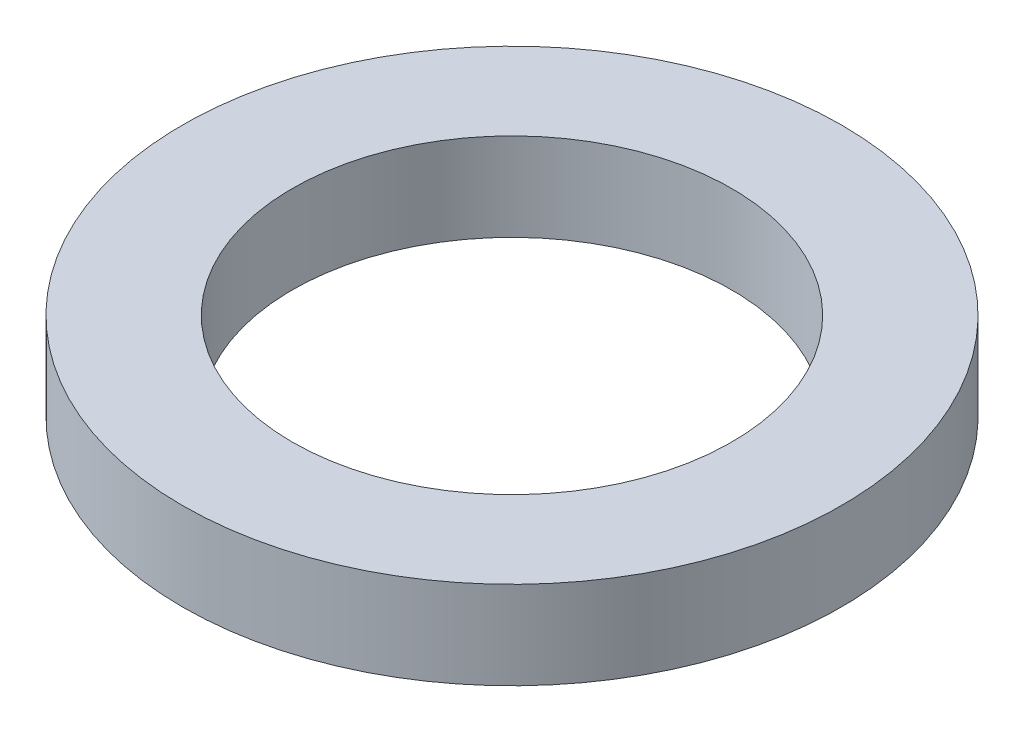
ISO-10303-21;
HEADER;
FILE_DESCRIPTION(('STEP AP214'),'2;1');
FILE_NAME('part.step','',(''),(''),'','','');
FILE_SCHEMA(('AUTOMOTIVE_DESIGN { 1 0 10303 214 1 1 1 1 }'));
ENDSEC;
DATA;
#1=APPLICATION_CONTEXT('core data for automotive mechanical design processes');
#2=APPLICATION_PROTOCOL_DEFINITION('international standard','automotive_design',2000,#1);
#3=PRODUCT_CONTEXT('',#1,'mechanical');
#4=PRODUCT('Part','Part','',(#3));
#5=PRODUCT_RELATED_PRODUCT_CATEGORY('part','',(#4));
#6=PRODUCT_DEFINITION_FORMATION('','',#4);
#7=PRODUCT_DEFINITION_CONTEXT('part definition',#1,'design');
#8=PRODUCT_DEFINITION('design','',#6,#7);
#9=PRODUCT_DEFINITION_SHAPE('','',#8);
#10=(LENGTH_UNIT() NAMED_UNIT(*) SI_UNIT(.MILLI.,.METRE.));
#11=(NAMED_UNIT(*) PLANE_ANGLE_UNIT() SI_UNIT($,.RADIAN.));
#12=(NAMED_UNIT(*) SI_UNIT($,.STERADIAN.) SOLID_ANGLE_UNIT());
#13=UNCERTAINTY_MEASURE_WITH_UNIT(LENGTH_MEASURE(1.E-05),#10,'distance_accuracy_value','');
#14=(GEOMETRIC_REPRESENTATION_CONTEXT(3) GLOBAL_UNCERTAINTY_ASSIGNED_CONTEXT((#13)) GLOBAL_UNIT_ASSIGNED_CONTEXT((#10,
#11,#12)) REPRESENTATION_CONTEXT('',''));
#15=CARTESIAN_POINT('',(0.,0.,0.));
#16=DIRECTION('',(0.,0.,1.));
#17=DIRECTION('',(1.,0.,0.));
#18=AXIS2_PLACEMENT_3D('',#15,#16,#17);
#19=CARTESIAN_POINT('',(0.,2.54,0.));
#20=DIRECTION('',(0.,-1.,0.));
#21=DIRECTION('',(0.,0.,-1.));
#22=AXIS2_PLACEMENT_3D('',#19,#20,#21);
#23=CYLINDRICAL_SURFACE('',#22,9.525);
#24=CARTESIAN_POINT('',(0.,2.54,0.));
#25=DIRECTION('',(0.,1.,0.));
#26=DIRECTION('',(0.,0.,1.));
#27=AXIS2_PLACEMENT_3D('',#24,#25,#26);
#28=CIRCLE('',#27,9.525);
#29=CARTESIAN_POINT('',(0.,2.54,9.525));
#30=VERTEX_POINT('',#29);
#31=EDGE_CURVE('E10',#30,#30,#28,.T.);
#32=ORIENTED_EDGE('',*,*,#31,.F.);
#33=EDGE_LOOP('',(#32));
#34=FACE_BOUND('',#33,.T.);
#35=CARTESIAN_POINT('',(0.,0.,0.));
#36=DIRECTION('',(0.,1.,0.));
#37=DIRECTION('',(0.,0.,1.));
#38=AXIS2_PLACEMENT_3D('',#35,#36,#37);
#39=CIRCLE('',#38,9.525);
#40=CARTESIAN_POINT('',(0.,0.,9.525));
#41=VERTEX_POINT('',#40);
#42=EDGE_CURVE('E39',#41,#41,#39,.T.);
#43=ORIENTED_EDGE('',*,*,#42,.T.);
#44=EDGE_LOOP('',(#43));
#45=FACE_BOUND('',#44,.T.);
#46=ADVANCED_FACE('F36',(#34,#45),#23,.T.);
#47=CARTESIAN_POINT('',(0.,2.54,0.));
#48=DIRECTION('',(0.,1.,0.));
#49=DIRECTION('',(0.,0.,1.));
#50=AXIS2_PLACEMENT_3D('',#47,#48,#49);
#51=PLANE('',#50);
#52=CARTESIAN_POINT('',(0.,2.54,0.));
#53=DIRECTION('',(0.,1.,0.));
#54=DIRECTION('',(0.,0.,1.));
#55=AXIS2_PLACEMENT_3D('',#52,#53,#54);
#56=CIRCLE('',#55,6.35);
#57=CARTESIAN_POINT('',(0.,2.54,6.35));
#58=VERTEX_POINT('',#57);
#59=EDGE_CURVE('E50',#58,#58,#56,.T.);
#60=ORIENTED_EDGE('',*,*,#59,.F.);
#61=EDGE_LOOP('',(#60));
#62=FACE_BOUND('',#61,.T.);
#63=ORIENTED_EDGE('',*,*,#31,.T.);
#64=EDGE_LOOP('',(#63));
#65=FACE_BOUND('',#64,.T.);
#66=ADVANCED_FACE('F56',(#62,#65),#51,.T.);
#67=CARTESIAN_POINT('',(0.,0.,0.));
#68=DIRECTION('',(0.,1.,0.));
#69=DIRECTION('',(0.,0.,1.));
#70=AXIS2_PLACEMENT_3D('',#67,#68,#69);
#71=PLANE('',#70);
#72=CARTESIAN_POINT('',(0.,0.,0.));
#73=DIRECTION('',(0.,1.,0.));
#74=DIRECTION('',(0.,0.,1.));
#75=AXIS2_PLACEMENT_3D('',#72,#73,#74);
#76=CIRCLE('',#75,6.35);
#77=CARTESIAN_POINT('',(0.,0.,6.35));
#78=VERTEX_POINT('',#77);
#79=EDGE_CURVE('E46',#78,#78,#76,.F.);
#80=ORIENTED_EDGE('',*,*,#79,.F.);
#81=EDGE_LOOP('',(#80));
#82=FACE_BOUND('',#81,.T.);
#83=ORIENTED_EDGE('',*,*,#42,.F.);
#84=EDGE_LOOP('',(#83));
#85=FACE_BOUND('',#84,.T.);
#86=ADVANCED_FACE('F58',(#82,#85),#71,.F.);
#87=CARTESIAN_POINT('',(0.,-17.9605122421383,0.));
#88=DIRECTION('',(0.,1.,0.));
#89=DIRECTION('',(0.,0.,1.));
#90=AXIS2_PLACEMENT_3D('',#87,#88,#89);
#91=CYLINDRICAL_SURFACE('',#90,6.35);
#92=ORIENTED_EDGE('',*,*,#79,.T.);
#93=EDGE_LOOP('',(#92));
#94=FACE_BOUND('',#93,.T.);
#95=ORIENTED_EDGE('',*,*,#59,.T.);
#96=EDGE_LOOP('',(#95));
#97=FACE_BOUND('',#96,.T.);
#98=ADVANCED_FACE('F54',(#94,#97),#91,.F.);
#99=CLOSED_SHELL('',(#46,#66,#86,#98));
#100=MANIFOLD_SOLID_BREP('B2',#99);
#101=ADVANCED_BREP_SHAPE_REPRESENTATION('',(#18,#100),#14);
#102=SHAPE_DEFINITION_REPRESENTATION(#9,#101);
ENDSEC;
END-ISO-10303-21;
